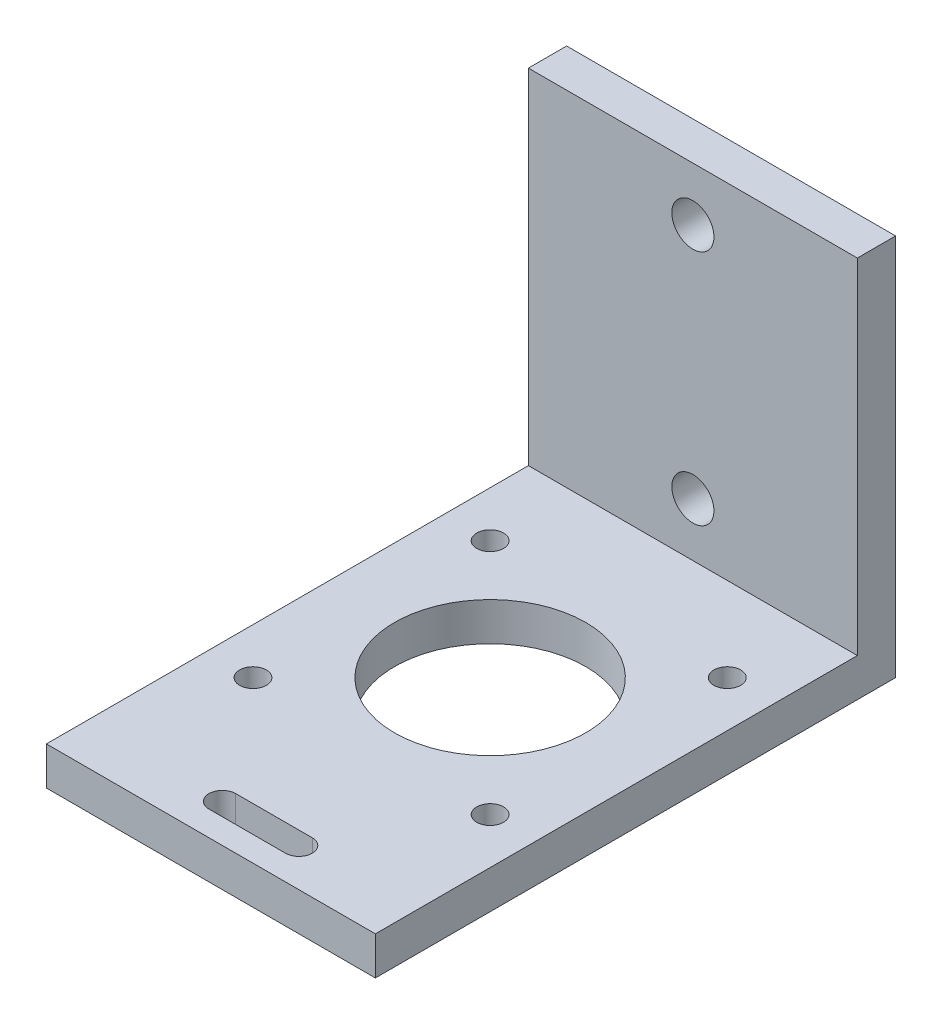
ISO-10303-21;
HEADER;
FILE_DESCRIPTION(('STEP AP214'),'2;1');
FILE_NAME('part.step','',(''),(''),'','','');
FILE_SCHEMA(('AUTOMOTIVE_DESIGN { 1 0 10303 214 1 1 1 1 }'));
ENDSEC;
DATA;
#1=APPLICATION_CONTEXT('core data for automotive mechanical design processes');
#2=APPLICATION_PROTOCOL_DEFINITION('international standard','automotive_design',2000,#1);
#3=PRODUCT_CONTEXT('',#1,'mechanical');
#4=PRODUCT('Part','Part','',(#3));
#5=PRODUCT_RELATED_PRODUCT_CATEGORY('part','',(#4));
#6=PRODUCT_DEFINITION_FORMATION('','',#4);
#7=PRODUCT_DEFINITION_CONTEXT('part definition',#1,'design');
#8=PRODUCT_DEFINITION('design','',#6,#7);
#9=PRODUCT_DEFINITION_SHAPE('','',#8);
#10=(LENGTH_UNIT() NAMED_UNIT(*) SI_UNIT(.MILLI.,.METRE.));
#11=(NAMED_UNIT(*) PLANE_ANGLE_UNIT() SI_UNIT($,.RADIAN.));
#12=(NAMED_UNIT(*) SI_UNIT($,.STERADIAN.) SOLID_ANGLE_UNIT());
#13=UNCERTAINTY_MEASURE_WITH_UNIT(LENGTH_MEASURE(1.E-05),#10,'distance_accuracy_value','');
#14=(GEOMETRIC_REPRESENTATION_CONTEXT(3) GLOBAL_UNCERTAINTY_ASSIGNED_CONTEXT((#13)) GLOBAL_UNIT_ASSIGNED_CONTEXT((#10,
#11,#12)) REPRESENTATION_CONTEXT('',''));
#15=CARTESIAN_POINT('',(0.,0.,0.));
#16=DIRECTION('',(0.,0.,1.));
#17=DIRECTION('',(1.,0.,0.));
#18=AXIS2_PLACEMENT_3D('',#15,#16,#17);
#19=CARTESIAN_POINT('',(0.,5.,0.));
#20=DIRECTION('',(0.,1.,0.));
#21=DIRECTION('',(0.,0.,1.));
#22=AXIS2_PLACEMENT_3D('',#19,#20,#21);
#23=PLANE('',#22);
#24=CARTESIAN_POINT('',(-17.8996913580223,5.,19.7878086419715));
#25=DIRECTION('',(0.,1.,0.));
#26=DIRECTION('',(0.,0.,1.));
#27=AXIS2_PLACEMENT_3D('',#24,#25,#26);
#28=CIRCLE('',#27,1.75);
#29=CARTESIAN_POINT('',(-17.8996913580223,5.,18.0378086419715));
#30=VERTEX_POINT('',#29);
#31=CARTESIAN_POINT('',(-17.8996913580222,5.,21.5378086419715));
#32=VERTEX_POINT('',#31);
#33=EDGE_CURVE('E68',#30,#32,#28,.T.);
#34=ORIENTED_EDGE('',*,*,#33,.F.);
#35=DIRECTION('',(-1.,0.,0.));
#36=VECTOR('',#35,1.);
#37=CARTESIAN_POINT('',(-17.8996913580223,5.,18.0378086419715));
#38=LINE('',#37,#36);
#39=CARTESIAN_POINT('',(-7.89969135802227,5.,18.0378086419715));
#40=VERTEX_POINT('',#39);
#41=EDGE_CURVE('E147',#40,#30,#38,.T.);
#42=ORIENTED_EDGE('',*,*,#41,.F.);
#43=CARTESIAN_POINT('',(-7.89969135802227,5.,19.7878086419715));
#44=DIRECTION('',(0.,1.,0.));
#45=DIRECTION('',(0.,0.,1.));
#46=AXIS2_PLACEMENT_3D('',#43,#44,#45);
#47=CIRCLE('',#46,1.75);
#48=CARTESIAN_POINT('',(-7.89969135802227,5.,21.5378086419715));
#49=VERTEX_POINT('',#48);
#50=EDGE_CURVE('E150',#49,#40,#47,.T.);
#51=ORIENTED_EDGE('',*,*,#50,.F.);
#52=DIRECTION('',(1.,0.,0.));
#53=VECTOR('',#52,1.);
#54=CARTESIAN_POINT('',(-17.8996913580222,5.,21.5378086419715));
#55=LINE('',#54,#53);
#56=EDGE_CURVE('E156',#32,#49,#55,.T.);
#57=ORIENTED_EDGE('',*,*,#56,.F.);
#58=EDGE_LOOP('',(#34,#42,#51,#57));
#59=FACE_BOUND('',#58,.T.);
#60=CARTESIAN_POINT('',(1.10030864197531,5.,3.78780864197531));
#61=DIRECTION('',(0.,1.,0.));
#62=DIRECTION('',(0.,0.,1.));
#63=AXIS2_PLACEMENT_3D('',#60,#61,#62);
#64=CIRCLE('',#63,1.75);
#65=CARTESIAN_POINT('',(1.10030864197531,5.,5.53780864197531));
#66=VERTEX_POINT('',#65);
#67=EDGE_CURVE('E223',#66,#66,#64,.T.);
#68=ORIENTED_EDGE('',*,*,#67,.F.);
#69=EDGE_LOOP('',(#68));
#70=FACE_BOUND('',#69,.T.);
#71=CARTESIAN_POINT('',(-29.8996913580247,5.,-27.2121913580247));
#72=DIRECTION('',(0.,1.,0.));
#73=DIRECTION('',(0.,0.,1.));
#74=AXIS2_PLACEMENT_3D('',#71,#72,#73);
#75=CIRCLE('',#74,1.75);
#76=CARTESIAN_POINT('',(-29.8996913580247,5.,-25.4621913580247));
#77=VERTEX_POINT('',#76);
#78=EDGE_CURVE('E235',#77,#77,#75,.T.);
#79=ORIENTED_EDGE('',*,*,#78,.F.);
#80=EDGE_LOOP('',(#79));
#81=FACE_BOUND('',#80,.T.);
#82=DIRECTION('',(0.,0.,-1.));
#83=VECTOR('',#82,1.);
#84=CARTESIAN_POINT('',(7.1003086419753,5.,-33.2121913580247));
#85=LINE('',#84,#83);
#86=CARTESIAN_POINT('',(7.1003086419753,5.,24.7878086419753));
#87=VERTEX_POINT('',#86);
#88=CARTESIAN_POINT('',(7.1003086419753,5.,-38.2121913580247));
#89=VERTEX_POINT('',#88);
#90=EDGE_CURVE('E60',#87,#89,#85,.T.);
#91=ORIENTED_EDGE('',*,*,#90,.T.);
#92=DIRECTION('',(1.,0.,0.));
#93=VECTOR('',#92,1.);
#94=CARTESIAN_POINT('',(-35.8996913580247,5.,-38.2121913580247));
#95=LINE('',#94,#93);
#96=CARTESIAN_POINT('',(-35.8996913580247,5.,-38.2121913580247));
#97=VERTEX_POINT('',#96);
#98=EDGE_CURVE('E213',#97,#89,#95,.T.);
#99=ORIENTED_EDGE('',*,*,#98,.F.);
#100=DIRECTION('',(0.,0.,1.));
#101=VECTOR('',#100,1.);
#102=CARTESIAN_POINT('',(-35.8996913580247,5.,-33.2121913580247));
#103=LINE('',#102,#101);
#104=CARTESIAN_POINT('',(-35.8996913580247,5.,24.7878086419753));
#105=VERTEX_POINT('',#104);
#106=EDGE_CURVE('E13',#97,#105,#103,.T.);
#107=ORIENTED_EDGE('',*,*,#106,.T.);
#108=DIRECTION('',(-1.,0.,0.));
#109=VECTOR('',#108,1.);
#110=CARTESIAN_POINT('',(7.1003086419753,5.,24.7878086419753));
#111=LINE('',#110,#109);
#112=EDGE_CURVE('E174',#87,#105,#111,.T.);
#113=ORIENTED_EDGE('',*,*,#112,.F.);
#114=EDGE_LOOP('',(#91,#99,#107,#113));
#115=FACE_BOUND('',#114,.T.);
#116=CARTESIAN_POINT('',(1.1003086419753,5.,-27.2121913580247));
#117=DIRECTION('',(0.,1.,0.));
#118=DIRECTION('',(0.,0.,1.));
#119=AXIS2_PLACEMENT_3D('',#116,#117,#118);
#120=CIRCLE('',#119,1.75);
#121=CARTESIAN_POINT('',(1.1003086419753,5.,-25.4621913580247));
#122=VERTEX_POINT('',#121);
#123=EDGE_CURVE('E241',#122,#122,#120,.T.);
#124=ORIENTED_EDGE('',*,*,#123,.F.);
#125=EDGE_LOOP('',(#124));
#126=FACE_BOUND('',#125,.T.);
#127=CARTESIAN_POINT('',(-29.8996913580247,5.,3.78780864197531));
#128=DIRECTION('',(0.,1.,0.));
#129=DIRECTION('',(0.,0.,1.));
#130=AXIS2_PLACEMENT_3D('',#127,#128,#129);
#131=CIRCLE('',#130,1.75);
#132=CARTESIAN_POINT('',(-29.8996913580247,5.,5.53780864197531));
#133=VERTEX_POINT('',#132);
#134=EDGE_CURVE('E229',#133,#133,#131,.T.);
#135=ORIENTED_EDGE('',*,*,#134,.F.);
#136=EDGE_LOOP('',(#135));
#137=FACE_BOUND('',#136,.T.);
#138=CARTESIAN_POINT('',(-14.3996913580247,5.,-11.7121913580247));
#139=DIRECTION('',(0.,1.,0.));
#140=DIRECTION('',(0.,0.,1.));
#141=AXIS2_PLACEMENT_3D('',#138,#139,#140);
#142=CIRCLE('',#141,12.5);
#143=CARTESIAN_POINT('',(-14.3996913580247,5.,0.787808641975312));
#144=VERTEX_POINT('',#143);
#145=EDGE_CURVE('E217',#144,#144,#142,.T.);
#146=ORIENTED_EDGE('',*,*,#145,.F.);
#147=EDGE_LOOP('',(#146));
#148=FACE_BOUND('',#147,.T.);
#149=ADVANCED_FACE('F51',(#59,#70,#81,#115,#126,#137,#148),#23,.T.);
#150=CARTESIAN_POINT('',(0.,0.,0.));
#151=DIRECTION('',(0.,1.,0.));
#152=DIRECTION('',(0.,0.,1.));
#153=AXIS2_PLACEMENT_3D('',#150,#151,#152);
#154=PLANE('',#153);
#155=DIRECTION('',(-1.,0.,0.));
#156=VECTOR('',#155,1.);
#157=CARTESIAN_POINT('',(-17.8996913580223,0.,18.0378086419715));
#158=LINE('',#157,#156);
#159=CARTESIAN_POINT('',(-7.89969135802227,0.,18.0378086419715));
#160=VERTEX_POINT('',#159);
#161=CARTESIAN_POINT('',(-17.8996913580223,0.,18.0378086419715));
#162=VERTEX_POINT('',#161);
#163=EDGE_CURVE('E137',#160,#162,#158,.T.);
#164=ORIENTED_EDGE('',*,*,#163,.T.);
#165=CARTESIAN_POINT('',(-17.8996913580223,0.,19.7878086419715));
#166=DIRECTION('',(0.,1.,0.));
#167=DIRECTION('',(0.,0.,1.));
#168=AXIS2_PLACEMENT_3D('',#165,#166,#167);
#169=CIRCLE('',#168,1.75);
#170=CARTESIAN_POINT('',(-17.8996913580222,0.,21.5378086419715));
#171=VERTEX_POINT('',#170);
#172=EDGE_CURVE('E131',#162,#171,#169,.T.);
#173=ORIENTED_EDGE('',*,*,#172,.T.);
#174=DIRECTION('',(1.,0.,0.));
#175=VECTOR('',#174,1.);
#176=CARTESIAN_POINT('',(-17.8996913580222,0.,21.5378086419715));
#177=LINE('',#176,#175);
#178=CARTESIAN_POINT('',(-7.89969135802227,0.,21.5378086419715));
#179=VERTEX_POINT('',#178);
#180=EDGE_CURVE('E140',#171,#179,#177,.T.);
#181=ORIENTED_EDGE('',*,*,#180,.T.);
#182=CARTESIAN_POINT('',(-7.89969135802227,0.,19.7878086419715));
#183=DIRECTION('',(0.,1.,0.));
#184=DIRECTION('',(0.,0.,1.));
#185=AXIS2_PLACEMENT_3D('',#182,#183,#184);
#186=CIRCLE('',#185,1.75);
#187=EDGE_CURVE('E76',#179,#160,#186,.T.);
#188=ORIENTED_EDGE('',*,*,#187,.T.);
#189=EDGE_LOOP('',(#164,#173,#181,#188));
#190=FACE_BOUND('',#189,.T.);
#191=DIRECTION('',(0.,0.,-1.));
#192=VECTOR('',#191,1.);
#193=CARTESIAN_POINT('',(7.1003086419753,0.,-33.2121913580247));
#194=LINE('',#193,#192);
#195=CARTESIAN_POINT('',(7.1003086419753,0.,24.7878086419753));
#196=VERTEX_POINT('',#195);
#197=CARTESIAN_POINT('',(7.1003086419753,0.,-43.2121913580247));
#198=VERTEX_POINT('',#197);
#199=EDGE_CURVE('E244',#196,#198,#194,.T.);
#200=ORIENTED_EDGE('',*,*,#199,.F.);
#201=DIRECTION('',(1.,0.,0.));
#202=VECTOR('',#201,1.);
#203=CARTESIAN_POINT('',(-35.8996913580247,0.,24.7878086419753));
#204=LINE('',#203,#202);
#205=CARTESIAN_POINT('',(-35.8996913580247,0.,24.7878086419753));
#206=VERTEX_POINT('',#205);
#207=EDGE_CURVE('E168',#206,#196,#204,.T.);
#208=ORIENTED_EDGE('',*,*,#207,.F.);
#209=DIRECTION('',(0.,0.,1.));
#210=VECTOR('',#209,1.);
#211=CARTESIAN_POINT('',(-35.8996913580247,0.,-33.2121913580247));
#212=LINE('',#211,#210);
#213=CARTESIAN_POINT('',(-35.8996913580247,0.,-43.2121913580247));
#214=VERTEX_POINT('',#213);
#215=EDGE_CURVE('E55',#214,#206,#212,.T.);
#216=ORIENTED_EDGE('',*,*,#215,.F.);
#217=DIRECTION('',(-1.,0.,0.));
#218=VECTOR('',#217,1.);
#219=CARTESIAN_POINT('',(-35.8996913580247,0.,-43.2121913580247));
#220=LINE('',#219,#218);
#221=EDGE_CURVE('E199',#198,#214,#220,.T.);
#222=ORIENTED_EDGE('',*,*,#221,.F.);
#223=EDGE_LOOP('',(#200,#208,#216,#222));
#224=FACE_BOUND('',#223,.T.);
#225=CARTESIAN_POINT('',(1.1003086419753,0.,-27.2121913580247));
#226=DIRECTION('',(0.,1.,0.));
#227=DIRECTION('',(0.,0.,1.));
#228=AXIS2_PLACEMENT_3D('',#225,#226,#227);
#229=CIRCLE('',#228,1.75);
#230=CARTESIAN_POINT('',(1.1003086419753,0.,-25.4621913580247));
#231=VERTEX_POINT('',#230);
#232=EDGE_CURVE('E238',#231,#231,#229,.T.);
#233=ORIENTED_EDGE('',*,*,#232,.T.);
#234=EDGE_LOOP('',(#233));
#235=FACE_BOUND('',#234,.T.);
#236=CARTESIAN_POINT('',(-29.8996913580247,0.,-27.2121913580247));
#237=DIRECTION('',(0.,1.,0.));
#238=DIRECTION('',(0.,0.,1.));
#239=AXIS2_PLACEMENT_3D('',#236,#237,#238);
#240=CIRCLE('',#239,1.75);
#241=CARTESIAN_POINT('',(-29.8996913580247,0.,-25.4621913580247));
#242=VERTEX_POINT('',#241);
#243=EDGE_CURVE('E232',#242,#242,#240,.T.);
#244=ORIENTED_EDGE('',*,*,#243,.T.);
#245=EDGE_LOOP('',(#244));
#246=FACE_BOUND('',#245,.T.);
#247=CARTESIAN_POINT('',(-29.8996913580247,0.,3.78780864197531));
#248=DIRECTION('',(0.,1.,0.));
#249=DIRECTION('',(0.,0.,1.));
#250=AXIS2_PLACEMENT_3D('',#247,#248,#249);
#251=CIRCLE('',#250,1.75);
#252=CARTESIAN_POINT('',(-29.8996913580247,0.,5.53780864197531));
#253=VERTEX_POINT('',#252);
#254=EDGE_CURVE('E226',#253,#253,#251,.T.);
#255=ORIENTED_EDGE('',*,*,#254,.T.);
#256=EDGE_LOOP('',(#255));
#257=FACE_BOUND('',#256,.T.);
#258=CARTESIAN_POINT('',(1.10030864197531,0.,3.78780864197531));
#259=DIRECTION('',(0.,1.,0.));
#260=DIRECTION('',(0.,0.,1.));
#261=AXIS2_PLACEMENT_3D('',#258,#259,#260);
#262=CIRCLE('',#261,1.75);
#263=CARTESIAN_POINT('',(1.10030864197531,0.,5.53780864197531));
#264=VERTEX_POINT('',#263);
#265=EDGE_CURVE('E220',#264,#264,#262,.T.);
#266=ORIENTED_EDGE('',*,*,#265,.T.);
#267=EDGE_LOOP('',(#266));
#268=FACE_BOUND('',#267,.T.);
#269=CARTESIAN_POINT('',(-14.3996913580247,0.,-11.7121913580247));
#270=DIRECTION('',(0.,1.,0.));
#271=DIRECTION('',(0.,0.,1.));
#272=AXIS2_PLACEMENT_3D('',#269,#270,#271);
#273=CIRCLE('',#272,12.5);
#274=CARTESIAN_POINT('',(-14.3996913580247,0.,0.787808641975312));
#275=VERTEX_POINT('',#274);
#276=EDGE_CURVE('E216',#275,#275,#273,.T.);
#277=ORIENTED_EDGE('',*,*,#276,.T.);
#278=EDGE_LOOP('',(#277));
#279=FACE_BOUND('',#278,.T.);
#280=ADVANCED_FACE('F144',(#190,#224,#235,#246,#257,#268,#279),#154,.F.);
#281=CARTESIAN_POINT('',(7.1003086419753,5.,-33.2121913580247));
#282=DIRECTION('',(-1.,0.,0.));
#283=DIRECTION('',(0.,0.,1.));
#284=AXIS2_PLACEMENT_3D('',#281,#282,#283);
#285=PLANE('',#284);
#286=ORIENTED_EDGE('',*,*,#199,.T.);
#287=DIRECTION('',(0.,-1.,0.));
#288=VECTOR('',#287,1.);
#289=CARTESIAN_POINT('',(7.1003086419753,0.,-43.2121913580247));
#290=LINE('',#289,#288);
#291=CARTESIAN_POINT('',(7.1003086419753,50.,-43.2121913580247));
#292=VERTEX_POINT('',#291);
#293=EDGE_CURVE('E196',#292,#198,#290,.T.);
#294=ORIENTED_EDGE('',*,*,#293,.F.);
#295=DIRECTION('',(0.,0.,1.));
#296=VECTOR('',#295,1.);
#297=CARTESIAN_POINT('',(7.1003086419753,50.,-43.2121913580247));
#298=LINE('',#297,#296);
#299=CARTESIAN_POINT('',(7.1003086419753,50.,-38.2121913580247));
#300=VERTEX_POINT('',#299);
#301=EDGE_CURVE('E202',#292,#300,#298,.T.);
#302=ORIENTED_EDGE('',*,*,#301,.T.);
#303=DIRECTION('',(0.,-1.,0.));
#304=VECTOR('',#303,1.);
#305=CARTESIAN_POINT('',(7.1003086419753,0.,-38.2121913580247));
#306=LINE('',#305,#304);
#307=EDGE_CURVE('E194',#300,#89,#306,.T.);
#308=ORIENTED_EDGE('',*,*,#307,.T.);
#309=ORIENTED_EDGE('',*,*,#90,.F.);
#310=DIRECTION('',(0.,1.,0.));
#311=VECTOR('',#310,1.);
#312=CARTESIAN_POINT('',(7.1003086419753,0.,24.7878086419753));
#313=LINE('',#312,#311);
#314=EDGE_CURVE('E171',#196,#87,#313,.T.);
#315=ORIENTED_EDGE('',*,*,#314,.F.);
#316=EDGE_LOOP('',(#286,#294,#302,#308,#309,#315));
#317=FACE_BOUND('',#316,.T.);
#318=ADVANCED_FACE('F53',(#317),#285,.F.);
#319=CARTESIAN_POINT('',(-35.8996913580247,5.,-33.2121913580247));
#320=DIRECTION('',(1.,0.,0.));
#321=DIRECTION('',(0.,0.,-1.));
#322=AXIS2_PLACEMENT_3D('',#319,#320,#321);
#323=PLANE('',#322);
#324=ORIENTED_EDGE('',*,*,#215,.T.);
#325=DIRECTION('',(0.,-1.,0.));
#326=VECTOR('',#325,1.);
#327=CARTESIAN_POINT('',(-35.8996913580247,5.,24.7878086419753));
#328=LINE('',#327,#326);
#329=EDGE_CURVE('E162',#105,#206,#328,.T.);
#330=ORIENTED_EDGE('',*,*,#329,.F.);
#331=ORIENTED_EDGE('',*,*,#106,.F.);
#332=DIRECTION('',(0.,1.,0.));
#333=VECTOR('',#332,1.);
#334=CARTESIAN_POINT('',(-35.8996913580247,0.,-38.2121913580247));
#335=LINE('',#334,#333);
#336=CARTESIAN_POINT('',(-35.8996913580247,50.,-38.2121913580247));
#337=VERTEX_POINT('',#336);
#338=EDGE_CURVE('E181',#97,#337,#335,.T.);
#339=ORIENTED_EDGE('',*,*,#338,.T.);
#340=DIRECTION('',(0.,0.,1.));
#341=VECTOR('',#340,1.);
#342=CARTESIAN_POINT('',(-35.8996913580247,50.,-43.2121913580247));
#343=LINE('',#342,#341);
#344=CARTESIAN_POINT('',(-35.8996913580247,50.,-43.2121913580247));
#345=VERTEX_POINT('',#344);
#346=EDGE_CURVE('E210',#345,#337,#343,.T.);
#347=ORIENTED_EDGE('',*,*,#346,.F.);
#348=DIRECTION('',(0.,1.,0.));
#349=VECTOR('',#348,1.);
#350=CARTESIAN_POINT('',(-35.8996913580247,0.,-43.2121913580247));
#351=LINE('',#350,#349);
#352=EDGE_CURVE('E190',#214,#345,#351,.T.);
#353=ORIENTED_EDGE('',*,*,#352,.F.);
#354=EDGE_LOOP('',(#324,#330,#331,#339,#347,#353));
#355=FACE_BOUND('',#354,.T.);
#356=ADVANCED_FACE('F254',(#355),#323,.F.);
#357=CARTESIAN_POINT('',(1.1003086419753,5.,-27.2121913580247));
#358=DIRECTION('',(0.,-1.,0.));
#359=DIRECTION('',(0.,0.,-1.));
#360=AXIS2_PLACEMENT_3D('',#357,#358,#359);
#361=CYLINDRICAL_SURFACE('',#360,1.75);
#362=ORIENTED_EDGE('',*,*,#123,.T.);
#363=EDGE_LOOP('',(#362));
#364=FACE_BOUND('',#363,.T.);
#365=ORIENTED_EDGE('',*,*,#232,.F.);
#366=EDGE_LOOP('',(#365));
#367=FACE_BOUND('',#366,.T.);
#368=ADVANCED_FACE('F279',(#364,#367),#361,.F.);
#369=CARTESIAN_POINT('',(-29.8996913580247,5.,-27.2121913580247));
#370=DIRECTION('',(0.,-1.,0.));
#371=DIRECTION('',(0.,0.,-1.));
#372=AXIS2_PLACEMENT_3D('',#369,#370,#371);
#373=CYLINDRICAL_SURFACE('',#372,1.75);
#374=ORIENTED_EDGE('',*,*,#78,.T.);
#375=EDGE_LOOP('',(#374));
#376=FACE_BOUND('',#375,.T.);
#377=ORIENTED_EDGE('',*,*,#243,.F.);
#378=EDGE_LOOP('',(#377));
#379=FACE_BOUND('',#378,.T.);
#380=ADVANCED_FACE('F291',(#376,#379),#373,.F.);
#381=CARTESIAN_POINT('',(-29.8996913580247,5.,3.78780864197531));
#382=DIRECTION('',(0.,-1.,0.));
#383=DIRECTION('',(0.,0.,-1.));
#384=AXIS2_PLACEMENT_3D('',#381,#382,#383);
#385=CYLINDRICAL_SURFACE('',#384,1.75);
#386=ORIENTED_EDGE('',*,*,#134,.T.);
#387=EDGE_LOOP('',(#386));
#388=FACE_BOUND('',#387,.T.);
#389=ORIENTED_EDGE('',*,*,#254,.F.);
#390=EDGE_LOOP('',(#389));
#391=FACE_BOUND('',#390,.T.);
#392=ADVANCED_FACE('F295',(#388,#391),#385,.F.);
#393=CARTESIAN_POINT('',(1.10030864197531,5.,3.78780864197531));
#394=DIRECTION('',(0.,-1.,0.));
#395=DIRECTION('',(0.,0.,-1.));
#396=AXIS2_PLACEMENT_3D('',#393,#394,#395);
#397=CYLINDRICAL_SURFACE('',#396,1.75);
#398=ORIENTED_EDGE('',*,*,#67,.T.);
#399=EDGE_LOOP('',(#398));
#400=FACE_BOUND('',#399,.T.);
#401=ORIENTED_EDGE('',*,*,#265,.F.);
#402=EDGE_LOOP('',(#401));
#403=FACE_BOUND('',#402,.T.);
#404=ADVANCED_FACE('F299',(#400,#403),#397,.F.);
#405=CARTESIAN_POINT('',(-14.3996913580247,5.,-11.7121913580247));
#406=DIRECTION('',(0.,-1.,0.));
#407=DIRECTION('',(0.,0.,-1.));
#408=AXIS2_PLACEMENT_3D('',#405,#406,#407);
#409=CYLINDRICAL_SURFACE('',#408,12.5);
#410=ORIENTED_EDGE('',*,*,#145,.T.);
#411=EDGE_LOOP('',(#410));
#412=FACE_BOUND('',#411,.T.);
#413=ORIENTED_EDGE('',*,*,#276,.F.);
#414=EDGE_LOOP('',(#413));
#415=FACE_BOUND('',#414,.T.);
#416=ADVANCED_FACE('F303',(#412,#415),#409,.F.);
#417=CARTESIAN_POINT('',(0.,0.,-38.2121913580247));
#418=DIRECTION('',(0.,0.,-1.));
#419=DIRECTION('',(-1.,0.,0.));
#420=AXIS2_PLACEMENT_3D('',#417,#418,#419);
#421=PLANE('',#420);
#422=CARTESIAN_POINT('',(-14.3996913580247,43.,-38.2121913580247));
#423=DIRECTION('',(0.,0.,1.));
#424=DIRECTION('',(1.,0.,0.));
#425=AXIS2_PLACEMENT_3D('',#422,#423,#424);
#426=CIRCLE('',#425,2.75);
#427=CARTESIAN_POINT('',(-11.6496913580247,43.,-38.2121913580247));
#428=VERTEX_POINT('',#427);
#429=EDGE_CURVE('E182',#428,#428,#426,.T.);
#430=ORIENTED_EDGE('',*,*,#429,.F.);
#431=EDGE_LOOP('',(#430));
#432=FACE_BOUND('',#431,.T.);
#433=CARTESIAN_POINT('',(-14.3996913580247,12.,-38.2121913580247));
#434=DIRECTION('',(0.,0.,1.));
#435=DIRECTION('',(1.,0.,0.));
#436=AXIS2_PLACEMENT_3D('',#433,#434,#435);
#437=CIRCLE('',#436,2.75);
#438=CARTESIAN_POINT('',(-11.6496913580247,12.,-38.2121913580247));
#439=VERTEX_POINT('',#438);
#440=EDGE_CURVE('E177',#439,#439,#437,.T.);
#441=ORIENTED_EDGE('',*,*,#440,.F.);
#442=EDGE_LOOP('',(#441));
#443=FACE_BOUND('',#442,.T.);
#444=ORIENTED_EDGE('',*,*,#338,.F.);
#445=ORIENTED_EDGE('',*,*,#98,.T.);
#446=ORIENTED_EDGE('',*,*,#307,.F.);
#447=DIRECTION('',(1.,0.,0.));
#448=VECTOR('',#447,1.);
#449=CARTESIAN_POINT('',(-35.8996913580247,50.,-38.2121913580247));
#450=LINE('',#449,#448);
#451=EDGE_CURVE('E204',#337,#300,#450,.T.);
#452=ORIENTED_EDGE('',*,*,#451,.F.);
#453=EDGE_LOOP('',(#444,#445,#446,#452));
#454=FACE_BOUND('',#453,.T.);
#455=ADVANCED_FACE('F268',(#432,#443,#454),#421,.F.);
#456=CARTESIAN_POINT('',(-35.8996913580247,50.,-43.2121913580247));
#457=DIRECTION('',(0.,-1.,0.));
#458=DIRECTION('',(1.,0.,0.));
#459=AXIS2_PLACEMENT_3D('',#456,#457,#458);
#460=PLANE('',#459);
#461=ORIENTED_EDGE('',*,*,#451,.T.);
#462=ORIENTED_EDGE('',*,*,#301,.F.);
#463=DIRECTION('',(1.,0.,0.));
#464=VECTOR('',#463,1.);
#465=CARTESIAN_POINT('',(-35.8996913580247,50.,-43.2121913580247));
#466=LINE('',#465,#464);
#467=EDGE_CURVE('E193',#345,#292,#466,.T.);
#468=ORIENTED_EDGE('',*,*,#467,.F.);
#469=ORIENTED_EDGE('',*,*,#346,.T.);
#470=EDGE_LOOP('',(#461,#462,#468,#469));
#471=FACE_BOUND('',#470,.T.);
#472=ADVANCED_FACE('F271',(#471),#460,.F.);
#473=CARTESIAN_POINT('',(0.,0.,-43.2121913580247));
#474=DIRECTION('',(0.,0.,-1.));
#475=DIRECTION('',(-1.,0.,0.));
#476=AXIS2_PLACEMENT_3D('',#473,#474,#475);
#477=PLANE('',#476);
#478=CARTESIAN_POINT('',(-14.3996913580247,43.,-43.2121913580247));
#479=DIRECTION('',(0.,0.,1.));
#480=DIRECTION('',(1.,0.,0.));
#481=AXIS2_PLACEMENT_3D('',#478,#479,#480);
#482=CIRCLE('',#481,2.75);
#483=CARTESIAN_POINT('',(-11.6496913580247,43.,-43.2121913580247));
#484=VERTEX_POINT('',#483);
#485=EDGE_CURVE('E178',#484,#484,#482,.T.);
#486=ORIENTED_EDGE('',*,*,#485,.T.);
#487=EDGE_LOOP('',(#486));
#488=FACE_BOUND('',#487,.T.);
#489=CARTESIAN_POINT('',(-14.3996913580247,12.,-43.2121913580247));
#490=DIRECTION('',(0.,0.,1.));
#491=DIRECTION('',(1.,0.,0.));
#492=AXIS2_PLACEMENT_3D('',#489,#490,#491);
#493=CIRCLE('',#492,2.75);
#494=CARTESIAN_POINT('',(-11.6496913580247,12.,-43.2121913580247));
#495=VERTEX_POINT('',#494);
#496=EDGE_CURVE('E185',#495,#495,#493,.T.);
#497=ORIENTED_EDGE('',*,*,#496,.T.);
#498=EDGE_LOOP('',(#497));
#499=FACE_BOUND('',#498,.T.);
#500=ORIENTED_EDGE('',*,*,#352,.T.);
#501=ORIENTED_EDGE('',*,*,#467,.T.);
#502=ORIENTED_EDGE('',*,*,#293,.T.);
#503=ORIENTED_EDGE('',*,*,#221,.T.);
#504=EDGE_LOOP('',(#500,#501,#502,#503));
#505=FACE_BOUND('',#504,.T.);
#506=ADVANCED_FACE('F273',(#488,#499,#505),#477,.T.);
#507=CARTESIAN_POINT('',(-14.3996913580247,12.,-43.2121913580247));
#508=DIRECTION('',(0.,0.,1.));
#509=DIRECTION('',(1.,0.,0.));
#510=AXIS2_PLACEMENT_3D('',#507,#508,#509);
#511=CYLINDRICAL_SURFACE('',#510,2.75);
#512=ORIENTED_EDGE('',*,*,#496,.F.);
#513=EDGE_LOOP('',(#512));
#514=FACE_BOUND('',#513,.T.);
#515=ORIENTED_EDGE('',*,*,#440,.T.);
#516=EDGE_LOOP('',(#515));
#517=FACE_BOUND('',#516,.T.);
#518=ADVANCED_FACE('F315',(#514,#517),#511,.F.);
#519=CARTESIAN_POINT('',(-14.3996913580247,43.,-43.2121913580247));
#520=DIRECTION('',(0.,0.,1.));
#521=DIRECTION('',(1.,0.,0.));
#522=AXIS2_PLACEMENT_3D('',#519,#520,#521);
#523=CYLINDRICAL_SURFACE('',#522,2.75);
#524=ORIENTED_EDGE('',*,*,#485,.F.);
#525=EDGE_LOOP('',(#524));
#526=FACE_BOUND('',#525,.T.);
#527=ORIENTED_EDGE('',*,*,#429,.T.);
#528=EDGE_LOOP('',(#527));
#529=FACE_BOUND('',#528,.T.);
#530=ADVANCED_FACE('F319',(#526,#529),#523,.F.);
#531=CARTESIAN_POINT('',(0.,0.,24.7878086419753));
#532=DIRECTION('',(0.,0.,1.));
#533=DIRECTION('',(1.,0.,0.));
#534=AXIS2_PLACEMENT_3D('',#531,#532,#533);
#535=PLANE('',#534);
#536=ORIENTED_EDGE('',*,*,#329,.T.);
#537=ORIENTED_EDGE('',*,*,#207,.T.);
#538=ORIENTED_EDGE('',*,*,#314,.T.);
#539=ORIENTED_EDGE('',*,*,#112,.T.);
#540=EDGE_LOOP('',(#536,#537,#538,#539));
#541=FACE_BOUND('',#540,.T.);
#542=ADVANCED_FACE('F259',(#541),#535,.T.);
#543=CARTESIAN_POINT('',(-17.8996913580223,0.,19.7878086419715));
#544=DIRECTION('',(0.,1.,0.));
#545=DIRECTION('',(0.,0.,1.));
#546=AXIS2_PLACEMENT_3D('',#543,#544,#545);
#547=CYLINDRICAL_SURFACE('',#546,1.75);
#548=ORIENTED_EDGE('',*,*,#33,.T.);
#549=DIRECTION('',(0.,1.,0.));
#550=VECTOR('',#549,1.);
#551=CARTESIAN_POINT('',(-17.8996913580222,0.,21.5378086419715));
#552=LINE('',#551,#550);
#553=EDGE_CURVE('E127',#171,#32,#552,.T.);
#554=ORIENTED_EDGE('',*,*,#553,.F.);
#555=ORIENTED_EDGE('',*,*,#172,.F.);
#556=DIRECTION('',(0.,1.,0.));
#557=VECTOR('',#556,1.);
#558=CARTESIAN_POINT('',(-17.8996913580223,0.,18.0378086419715));
#559=LINE('',#558,#557);
#560=EDGE_CURVE('E160',#162,#30,#559,.T.);
#561=ORIENTED_EDGE('',*,*,#560,.T.);
#562=EDGE_LOOP('',(#548,#554,#555,#561));
#563=FACE_BOUND('',#562,.T.);
#564=ADVANCED_FACE('F129',(#563),#547,.F.);
#565=CARTESIAN_POINT('',(-17.8996913580223,0.,18.0378086419715));
#566=DIRECTION('',(0.,0.,-1.));
#567=DIRECTION('',(-1.,0.,0.));
#568=AXIS2_PLACEMENT_3D('',#565,#566,#567);
#569=PLANE('',#568);
#570=ORIENTED_EDGE('',*,*,#41,.T.);
#571=ORIENTED_EDGE('',*,*,#560,.F.);
#572=ORIENTED_EDGE('',*,*,#163,.F.);
#573=DIRECTION('',(0.,1.,0.));
#574=VECTOR('',#573,1.);
#575=CARTESIAN_POINT('',(-7.89969135802227,0.,18.0378086419715));
#576=LINE('',#575,#574);
#577=EDGE_CURVE('E163',#160,#40,#576,.T.);
#578=ORIENTED_EDGE('',*,*,#577,.T.);
#579=EDGE_LOOP('',(#570,#571,#572,#578));
#580=FACE_BOUND('',#579,.T.);
#581=ADVANCED_FACE('F327',(#580),#569,.F.);
#582=CARTESIAN_POINT('',(-7.89969135802227,0.,19.7878086419715));
#583=DIRECTION('',(0.,1.,0.));
#584=DIRECTION('',(0.,0.,1.));
#585=AXIS2_PLACEMENT_3D('',#582,#583,#584);
#586=CYLINDRICAL_SURFACE('',#585,1.75);
#587=ORIENTED_EDGE('',*,*,#50,.T.);
#588=ORIENTED_EDGE('',*,*,#577,.F.);
#589=ORIENTED_EDGE('',*,*,#187,.F.);
#590=DIRECTION('',(0.,1.,0.));
#591=VECTOR('',#590,1.);
#592=CARTESIAN_POINT('',(-7.89969135802227,0.,21.5378086419715));
#593=LINE('',#592,#591);
#594=EDGE_CURVE('E136',#179,#49,#593,.T.);
#595=ORIENTED_EDGE('',*,*,#594,.T.);
#596=EDGE_LOOP('',(#587,#588,#589,#595));
#597=FACE_BOUND('',#596,.T.);
#598=ADVANCED_FACE('F330',(#597),#586,.F.);
#599=CARTESIAN_POINT('',(-17.8996913580222,0.,21.5378086419715));
#600=DIRECTION('',(0.,0.,1.));
#601=DIRECTION('',(1.,0.,0.));
#602=AXIS2_PLACEMENT_3D('',#599,#600,#601);
#603=PLANE('',#602);
#604=ORIENTED_EDGE('',*,*,#56,.T.);
#605=ORIENTED_EDGE('',*,*,#594,.F.);
#606=ORIENTED_EDGE('',*,*,#180,.F.);
#607=ORIENTED_EDGE('',*,*,#553,.T.);
#608=EDGE_LOOP('',(#604,#605,#606,#607));
#609=FACE_BOUND('',#608,.T.);
#610=ADVANCED_FACE('F141',(#609),#603,.F.);
#611=CLOSED_SHELL('',(#149,#280,#318,#356,#368,#380,#392,#404,#416,#455,#472,#506,#518,#530,
#542,#564,#581,#598,#610));
#612=MANIFOLD_SOLID_BREP('B2',#611);
#613=ADVANCED_BREP_SHAPE_REPRESENTATION('',(#18,#612),#14);
#614=SHAPE_DEFINITION_REPRESENTATION(#9,#613);
ENDSEC;
END-ISO-10303-21;
